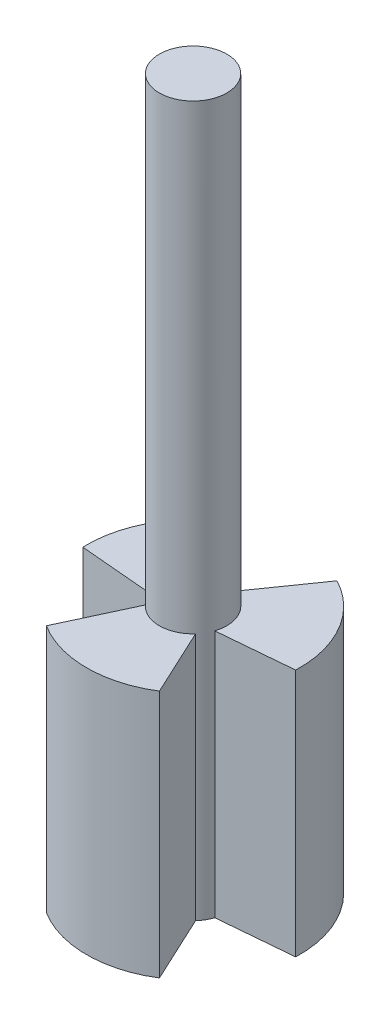
ISO-10303-21;
HEADER;
FILE_DESCRIPTION(('STEP AP214'),'2;1');
FILE_NAME('part.step','',(''),(''),'','','');
FILE_SCHEMA(('AUTOMOTIVE_DESIGN { 1 0 10303 214 1 1 1 1 }'));
ENDSEC;
DATA;
#1=APPLICATION_CONTEXT('core data for automotive mechanical design processes');
#2=APPLICATION_PROTOCOL_DEFINITION('international standard','automotive_design',2000,#1);
#3=PRODUCT_CONTEXT('',#1,'mechanical');
#4=PRODUCT('Part','Part','',(#3));
#5=PRODUCT_RELATED_PRODUCT_CATEGORY('part','',(#4));
#6=PRODUCT_DEFINITION_FORMATION('','',#4);
#7=PRODUCT_DEFINITION_CONTEXT('part definition',#1,'design');
#8=PRODUCT_DEFINITION('design','',#6,#7);
#9=PRODUCT_DEFINITION_SHAPE('','',#8);
#10=(LENGTH_UNIT() NAMED_UNIT(*) SI_UNIT(.MILLI.,.METRE.));
#11=(NAMED_UNIT(*) PLANE_ANGLE_UNIT() SI_UNIT($,.RADIAN.));
#12=(NAMED_UNIT(*) SI_UNIT($,.STERADIAN.) SOLID_ANGLE_UNIT());
#13=UNCERTAINTY_MEASURE_WITH_UNIT(LENGTH_MEASURE(1.E-05),#10,'distance_accuracy_value','');
#14=(GEOMETRIC_REPRESENTATION_CONTEXT(3) GLOBAL_UNCERTAINTY_ASSIGNED_CONTEXT((#13)) GLOBAL_UNIT_ASSIGNED_CONTEXT((#10,
#11,#12)) REPRESENTATION_CONTEXT('',''));
#15=CARTESIAN_POINT('',(0.,0.,0.));
#16=DIRECTION('',(0.,0.,1.));
#17=DIRECTION('',(1.,0.,0.));
#18=AXIS2_PLACEMENT_3D('',#15,#16,#17);
#19=CARTESIAN_POINT('',(5.59924741554355E-13,1469.49958708757,3.10503720316506E-13));
#20=DIRECTION('',(0.,-1.,0.));
#21=DIRECTION('',(0.,0.,-1.));
#22=AXIS2_PLACEMENT_3D('',#19,#20,#21);
#23=CYLINDRICAL_SURFACE('',#22,15.24);
#24=DIRECTION('',(0.,-1.,0.));
#25=VECTOR('',#24,1.);
#26=CARTESIAN_POINT('',(-8.09608369943268,1689.41142869452,12.9116625084371));
#27=LINE('',#26,#25);
#28=CARTESIAN_POINT('',(-8.09608369943268,1469.49958708757,12.9116625084371));
#29=VERTEX_POINT('',#28);
#30=CARTESIAN_POINT('',(-8.09608369943268,1433.93958708757,12.9116625084371));
#31=VERTEX_POINT('',#30);
#32=EDGE_CURVE('E134',#29,#31,#27,.T.);
#33=ORIENTED_EDGE('',*,*,#32,.T.);
#34=CARTESIAN_POINT('',(5.59924741554355E-13,1433.93958708757,3.10503720316506E-13));
#35=DIRECTION('',(0.,-1.,0.));
#36=DIRECTION('',(0.,0.,-1.));
#37=AXIS2_PLACEMENT_3D('',#34,#35,#36);
#38=CIRCLE('',#37,15.24);
#39=CARTESIAN_POINT('',(8.09608369943362,1433.93958708757,12.9116625084372));
#40=VERTEX_POINT('',#39);
#41=EDGE_CURVE('E164',#40,#31,#38,.T.);
#42=ORIENTED_EDGE('',*,*,#41,.F.);
#43=DIRECTION('',(0.,-1.,0.));
#44=VECTOR('',#43,1.);
#45=CARTESIAN_POINT('',(8.09608369943362,1689.41142869452,12.9116625084372));
#46=LINE('',#45,#44);
#47=CARTESIAN_POINT('',(8.09608369943362,1469.49958708757,12.9116625084372));
#48=VERTEX_POINT('',#47);
#49=EDGE_CURVE('E198',#48,#40,#46,.T.);
#50=ORIENTED_EDGE('',*,*,#49,.F.);
#51=CARTESIAN_POINT('',(5.59924741554355E-13,1469.49958708757,3.10503720316506E-13));
#52=DIRECTION('',(0.,-1.,0.));
#53=DIRECTION('',(0.,0.,-1.));
#54=AXIS2_PLACEMENT_3D('',#51,#52,#53);
#55=CIRCLE('',#54,15.24);
#56=EDGE_CURVE('E158',#48,#29,#55,.T.);
#57=ORIENTED_EDGE('',*,*,#56,.T.);
#58=EDGE_LOOP('',(#33,#42,#50,#57));
#59=FACE_BOUND('',#58,.T.);
#60=ADVANCED_FACE('F38',(#59),#23,.T.);
#61=CARTESIAN_POINT('',(5.59924741554355E-13,1469.49958708757,3.10503720316506E-13));
#62=DIRECTION('',(0.,-1.,0.));
#63=DIRECTION('',(0.,0.,-1.));
#64=AXIS2_PLACEMENT_3D('',#61,#62,#63);
#65=PLANE('',#64);
#66=CARTESIAN_POINT('',(5.59924741554355E-13,1469.49958708757,3.10503720316506E-13));
#67=DIRECTION('',(0.,-1.,0.));
#68=DIRECTION('',(0.,0.,-1.));
#69=AXIS2_PLACEMENT_3D('',#66,#67,#68);
#70=CIRCLE('',#69,4.826);
#71=CARTESIAN_POINT('',(3.58290527150522,1469.49958708757,3.23312013625014));
#72=VERTEX_POINT('',#71);
#73=CARTESIAN_POINT('',(-3.58290527150415,1469.49958708757,3.23312013625009));
#74=VERTEX_POINT('',#73);
#75=EDGE_CURVE('E46',#72,#74,#70,.T.);
#76=ORIENTED_EDGE('',*,*,#75,.T.);
#77=DIRECTION('',(0.422618261740707,0.,-0.906307787036647));
#78=VECTOR('',#77,1.);
#79=CARTESIAN_POINT('',(-3.58290527150415,1469.49958708757,3.23312013625009));
#80=LINE('',#79,#78);
#81=EDGE_CURVE('E137',#29,#74,#80,.T.);
#82=ORIENTED_EDGE('',*,*,#81,.F.);
#83=ORIENTED_EDGE('',*,*,#56,.F.);
#84=DIRECTION('',(0.422618261740694,0.,0.906307787036652));
#85=VECTOR('',#84,1.);
#86=CARTESIAN_POINT('',(3.58290527150522,1469.49958708757,3.23312013625014));
#87=LINE('',#86,#85);
#88=EDGE_CURVE('E147',#72,#48,#87,.T.);
#89=ORIENTED_EDGE('',*,*,#88,.F.);
#90=EDGE_LOOP('',(#76,#82,#83,#89));
#91=FACE_BOUND('',#90,.T.);
#92=ADVANCED_FACE('F146',(#91),#65,.F.);
#93=DIRECTION('',(0.,-1.,0.));
#94=VECTOR('',#93,1.);
#95=CARTESIAN_POINT('',(15.2298695871145,1689.41142869452,0.555582900656143));
#96=LINE('',#95,#94);
#97=CARTESIAN_POINT('',(15.2298695871145,1469.49958708757,0.555582900656143));
#98=VERTEX_POINT('',#97);
#99=CARTESIAN_POINT('',(15.2298695871145,1433.93958708757,0.555582900656142));
#100=VERTEX_POINT('',#99);
#101=EDGE_CURVE('E194',#98,#100,#96,.T.);
#102=ORIENTED_EDGE('',*,*,#101,.T.);
#103=CARTESIAN_POINT('',(7.13378588768141,1433.93958708757,-13.4672454090923));
#104=VERTEX_POINT('',#103);
#105=EDGE_CURVE('E162',#104,#100,#38,.T.);
#106=ORIENTED_EDGE('',*,*,#105,.F.);
#107=DIRECTION('',(0.,-1.,0.));
#108=VECTOR('',#107,1.);
#109=CARTESIAN_POINT('',(7.13378588768141,1690.00689932581,-13.4672454090923));
#110=LINE('',#109,#108);
#111=CARTESIAN_POINT('',(7.13378588768141,1469.49958708757,-13.4672454090923));
#112=VERTEX_POINT('',#111);
#113=EDGE_CURVE('E175',#112,#104,#110,.T.);
#114=ORIENTED_EDGE('',*,*,#113,.F.);
#115=EDGE_CURVE('E154',#112,#98,#55,.T.);
#116=ORIENTED_EDGE('',*,*,#115,.T.);
#117=EDGE_LOOP('',(#102,#106,#114,#116));
#118=FACE_BOUND('',#117,.T.);
#119=ADVANCED_FACE('F247',(#118),#23,.T.);
#120=CARTESIAN_POINT('',(1.00851153572756,1469.49958708757,-4.71944705260083));
#121=VERTEX_POINT('',#120);
#122=CARTESIAN_POINT('',(4.59141680723223,1469.49958708757,1.48632691635166));
#123=VERTEX_POINT('',#122);
#124=EDGE_CURVE('E11',#121,#123,#70,.T.);
#125=ORIENTED_EDGE('',*,*,#124,.T.);
#126=DIRECTION('',(-0.996194698091746,0.,0.0871557427476548));
#127=VECTOR('',#126,1.);
#128=CARTESIAN_POINT('',(4.59141680723223,1469.49958708757,1.48632691635166));
#129=LINE('',#128,#127);
#130=EDGE_CURVE('E133',#98,#123,#129,.T.);
#131=ORIENTED_EDGE('',*,*,#130,.F.);
#132=ORIENTED_EDGE('',*,*,#115,.F.);
#133=DIRECTION('',(0.573576436351047,0.,-0.819152044288991));
#134=VECTOR('',#133,1.);
#135=CARTESIAN_POINT('',(1.00851153572756,1469.49958708757,-4.71944705260083));
#136=LINE('',#135,#134);
#137=EDGE_CURVE('E178',#121,#112,#136,.T.);
#138=ORIENTED_EDGE('',*,*,#137,.F.);
#139=EDGE_LOOP('',(#125,#131,#132,#138));
#140=FACE_BOUND('',#139,.T.);
#141=ADVANCED_FACE('F240',(#140),#65,.F.);
#142=CARTESIAN_POINT('',(5.59924741554355E-13,1535.53958708757,3.10503720316506E-13));
#143=DIRECTION('',(0.,-1.,0.));
#144=DIRECTION('',(0.,0.,-1.));
#145=AXIS2_PLACEMENT_3D('',#142,#143,#144);
#146=CYLINDRICAL_SURFACE('',#145,4.826);
#147=CARTESIAN_POINT('',(5.59924741554355E-13,1535.53958708757,3.10503720316506E-13));
#148=DIRECTION('',(0.,1.,0.));
#149=DIRECTION('',(0.,0.,1.));
#150=AXIS2_PLACEMENT_3D('',#147,#148,#149);
#151=CIRCLE('',#150,4.826);
#152=CARTESIAN_POINT('',(5.59924741554355E-13,1535.53958708757,4.82600000000031));
#153=VERTEX_POINT('',#152);
#154=EDGE_CURVE('E148',#153,#153,#151,.T.);
#155=ORIENTED_EDGE('',*,*,#154,.F.);
#156=EDGE_LOOP('',(#155));
#157=FACE_BOUND('',#156,.T.);
#158=ORIENTED_EDGE('',*,*,#124,.F.);
#159=DIRECTION('',(0.,-1.,0.));
#160=VECTOR('',#159,1.);
#161=CARTESIAN_POINT('',(1.00851153572756,1690.00689932581,-4.71944705260083));
#162=LINE('',#161,#160);
#163=CARTESIAN_POINT('',(1.00851153572756,1433.93958708757,-4.71944705260083));
#164=VERTEX_POINT('',#163);
#165=EDGE_CURVE('E173',#121,#164,#162,.T.);
#166=ORIENTED_EDGE('',*,*,#165,.T.);
#167=CARTESIAN_POINT('',(5.59924741554355E-13,1433.93958708757,3.10503720316506E-13));
#168=DIRECTION('',(0.,-1.,0.));
#169=DIRECTION('',(0.,0.,-1.));
#170=AXIS2_PLACEMENT_3D('',#167,#168,#169);
#171=CIRCLE('',#170,4.826);
#172=CARTESIAN_POINT('',(-1.00851153572644,1433.93958708757,-4.71944705260083));
#173=VERTEX_POINT('',#172);
#174=EDGE_CURVE('E185',#173,#164,#171,.T.);
#175=ORIENTED_EDGE('',*,*,#174,.F.);
#176=DIRECTION('',(0.,-1.,0.));
#177=VECTOR('',#176,1.);
#178=CARTESIAN_POINT('',(-1.00851153572644,1690.00689932581,-4.71944705260083));
#179=LINE('',#178,#177);
#180=CARTESIAN_POINT('',(-1.00851153572644,1469.49958708757,-4.71944705260083));
#181=VERTEX_POINT('',#180);
#182=EDGE_CURVE('E167',#181,#173,#179,.T.);
#183=ORIENTED_EDGE('',*,*,#182,.F.);
#184=CARTESIAN_POINT('',(-4.59141680723113,1469.49958708757,1.48632691635159));
#185=VERTEX_POINT('',#184);
#186=EDGE_CURVE('E47',#185,#181,#70,.T.);
#187=ORIENTED_EDGE('',*,*,#186,.F.);
#188=DIRECTION('',(0.,-1.,0.));
#189=VECTOR('',#188,1.);
#190=CARTESIAN_POINT('',(-4.59141680723113,1689.41142869452,1.48632691635159));
#191=LINE('',#190,#189);
#192=CARTESIAN_POINT('',(-4.59141680723113,1433.93958708757,1.48632691635159));
#193=VERTEX_POINT('',#192);
#194=EDGE_CURVE('E54',#185,#193,#191,.T.);
#195=ORIENTED_EDGE('',*,*,#194,.T.);
#196=CARTESIAN_POINT('',(5.59924741554355E-13,1433.93958708757,3.10503720316506E-13));
#197=DIRECTION('',(0.,-1.,0.));
#198=DIRECTION('',(0.,0.,-1.));
#199=AXIS2_PLACEMENT_3D('',#196,#197,#198);
#200=CIRCLE('',#199,4.826);
#201=CARTESIAN_POINT('',(-3.58290527150415,1433.93958708757,3.23312013625009));
#202=VERTEX_POINT('',#201);
#203=EDGE_CURVE('E130',#202,#193,#200,.T.);
#204=ORIENTED_EDGE('',*,*,#203,.F.);
#205=DIRECTION('',(0.,-1.,0.));
#206=VECTOR('',#205,1.);
#207=CARTESIAN_POINT('',(-3.58290527150415,1689.41142869452,3.23312013625009));
#208=LINE('',#207,#206);
#209=EDGE_CURVE('E125',#74,#202,#208,.T.);
#210=ORIENTED_EDGE('',*,*,#209,.F.);
#211=ORIENTED_EDGE('',*,*,#75,.F.);
#212=DIRECTION('',(0.,-1.,0.));
#213=VECTOR('',#212,1.);
#214=CARTESIAN_POINT('',(3.58290527150522,1689.41142869452,3.23312013625014));
#215=LINE('',#214,#213);
#216=CARTESIAN_POINT('',(3.58290527150522,1433.93958708757,3.23312013625014));
#217=VERTEX_POINT('',#216);
#218=EDGE_CURVE('E61',#72,#217,#215,.T.);
#219=ORIENTED_EDGE('',*,*,#218,.T.);
#220=CARTESIAN_POINT('',(5.59924741554355E-13,1433.93958708757,3.10503720316506E-13));
#221=DIRECTION('',(0.,-1.,0.));
#222=DIRECTION('',(0.,0.,-1.));
#223=AXIS2_PLACEMENT_3D('',#220,#221,#222);
#224=CIRCLE('',#223,4.826);
#225=CARTESIAN_POINT('',(4.59141680723223,1433.93958708757,1.48632691635166));
#226=VERTEX_POINT('',#225);
#227=EDGE_CURVE('E205',#226,#217,#224,.T.);
#228=ORIENTED_EDGE('',*,*,#227,.F.);
#229=DIRECTION('',(0.,-1.,0.));
#230=VECTOR('',#229,1.);
#231=CARTESIAN_POINT('',(4.59141680723223,1689.41142869452,1.48632691635166));
#232=LINE('',#231,#230);
#233=EDGE_CURVE('E184',#123,#226,#232,.T.);
#234=ORIENTED_EDGE('',*,*,#233,.F.);
#235=EDGE_LOOP('',(#158,#166,#175,#183,#187,#195,#204,#210,#211,#219,#228,#234));
#236=FACE_BOUND('',#235,.T.);
#237=ADVANCED_FACE('F40',(#157,#236),#146,.T.);
#238=CARTESIAN_POINT('',(5.59924741554355E-13,1535.53958708757,3.10503720316506E-13));
#239=DIRECTION('',(0.,1.,0.));
#240=DIRECTION('',(0.,0.,1.));
#241=AXIS2_PLACEMENT_3D('',#238,#239,#240);
#242=PLANE('',#241);
#243=ORIENTED_EDGE('',*,*,#154,.T.);
#244=EDGE_LOOP('',(#243));
#245=FACE_BOUND('',#244,.T.);
#246=ADVANCED_FACE('F245',(#245),#242,.T.);
#247=DIRECTION('',(0.,-1.,0.));
#248=VECTOR('',#247,1.);
#249=CARTESIAN_POINT('',(-15.2298695871134,1689.41142869452,0.555582900655931));
#250=LINE('',#249,#248);
#251=CARTESIAN_POINT('',(-15.2298695871134,1469.49958708757,0.555582900655931));
#252=VERTEX_POINT('',#251);
#253=CARTESIAN_POINT('',(-15.2298695871134,1433.93958708757,0.55558290065593));
#254=VERTEX_POINT('',#253);
#255=EDGE_CURVE('E214',#252,#254,#250,.T.);
#256=ORIENTED_EDGE('',*,*,#255,.F.);
#257=CARTESIAN_POINT('',(-7.13378588768029,1469.49958708757,-13.4672454090923));
#258=VERTEX_POINT('',#257);
#259=EDGE_CURVE('E160',#252,#258,#55,.T.);
#260=ORIENTED_EDGE('',*,*,#259,.T.);
#261=DIRECTION('',(0.,-1.,0.));
#262=VECTOR('',#261,1.);
#263=CARTESIAN_POINT('',(-7.13378588768029,1690.00689932581,-13.4672454090923));
#264=LINE('',#263,#262);
#265=CARTESIAN_POINT('',(-7.13378588768029,1433.93958708757,-13.4672454090923));
#266=VERTEX_POINT('',#265);
#267=EDGE_CURVE('E170',#258,#266,#264,.T.);
#268=ORIENTED_EDGE('',*,*,#267,.T.);
#269=EDGE_CURVE('E165',#254,#266,#38,.T.);
#270=ORIENTED_EDGE('',*,*,#269,.F.);
#271=EDGE_LOOP('',(#256,#260,#268,#270));
#272=FACE_BOUND('',#271,.T.);
#273=ADVANCED_FACE('F232',(#272),#23,.T.);
#274=ORIENTED_EDGE('',*,*,#259,.F.);
#275=DIRECTION('',(-0.996194698091745,0.,-0.0871557427476687));
#276=VECTOR('',#275,1.);
#277=CARTESIAN_POINT('',(-4.59141680723113,1469.49958708757,1.48632691635159));
#278=LINE('',#277,#276);
#279=EDGE_CURVE('E143',#185,#252,#278,.T.);
#280=ORIENTED_EDGE('',*,*,#279,.F.);
#281=ORIENTED_EDGE('',*,*,#186,.T.);
#282=DIRECTION('',(0.573576436351047,0.,0.819152044288991));
#283=VECTOR('',#282,1.);
#284=CARTESIAN_POINT('',(-1.00851153572644,1469.49958708757,-4.71944705260083));
#285=LINE('',#284,#283);
#286=EDGE_CURVE('E181',#258,#181,#285,.T.);
#287=ORIENTED_EDGE('',*,*,#286,.F.);
#288=EDGE_LOOP('',(#274,#280,#281,#287));
#289=FACE_BOUND('',#288,.T.);
#290=ADVANCED_FACE('F237',(#289),#65,.F.);
#291=CARTESIAN_POINT('',(5.59924741554355E-13,1433.93958708757,3.10503720316506E-13));
#292=DIRECTION('',(0.,1.,0.));
#293=DIRECTION('',(0.,0.,1.));
#294=AXIS2_PLACEMENT_3D('',#291,#292,#293);
#295=PLANE('',#294);
#296=ORIENTED_EDGE('',*,*,#203,.T.);
#297=DIRECTION('',(-0.996194698091745,0.,-0.0871557427476687));
#298=VECTOR('',#297,1.);
#299=CARTESIAN_POINT('',(-4.59141680723113,1433.93958708757,1.48632691635159));
#300=LINE('',#299,#298);
#301=EDGE_CURVE('E217',#193,#254,#300,.T.);
#302=ORIENTED_EDGE('',*,*,#301,.T.);
#303=ORIENTED_EDGE('',*,*,#269,.T.);
#304=DIRECTION('',(0.573576436351047,0.,0.819152044288991));
#305=VECTOR('',#304,1.);
#306=CARTESIAN_POINT('',(-1.00851153572644,1433.93958708757,-4.71944705260083));
#307=LINE('',#306,#305);
#308=EDGE_CURVE('E177',#266,#173,#307,.T.);
#309=ORIENTED_EDGE('',*,*,#308,.T.);
#310=ORIENTED_EDGE('',*,*,#174,.T.);
#311=DIRECTION('',(0.573576436351047,0.,-0.819152044288991));
#312=VECTOR('',#311,1.);
#313=CARTESIAN_POINT('',(1.00851153572756,1433.93958708757,-4.71944705260083));
#314=LINE('',#313,#312);
#315=EDGE_CURVE('E180',#164,#104,#314,.T.);
#316=ORIENTED_EDGE('',*,*,#315,.T.);
#317=ORIENTED_EDGE('',*,*,#105,.T.);
#318=DIRECTION('',(-0.996194698091746,0.,0.0871557427476548));
#319=VECTOR('',#318,1.);
#320=CARTESIAN_POINT('',(4.59141680723223,1433.93958708757,1.48632691635166));
#321=LINE('',#320,#319);
#322=EDGE_CURVE('E200',#100,#226,#321,.T.);
#323=ORIENTED_EDGE('',*,*,#322,.T.);
#324=ORIENTED_EDGE('',*,*,#227,.T.);
#325=DIRECTION('',(0.422618261740694,0.,0.906307787036652));
#326=VECTOR('',#325,1.);
#327=CARTESIAN_POINT('',(3.58290527150522,1433.93958708757,3.23312013625014));
#328=LINE('',#327,#326);
#329=EDGE_CURVE('E202',#217,#40,#328,.T.);
#330=ORIENTED_EDGE('',*,*,#329,.T.);
#331=ORIENTED_EDGE('',*,*,#41,.T.);
#332=DIRECTION('',(0.422618261740707,0.,-0.906307787036647));
#333=VECTOR('',#332,1.);
#334=CARTESIAN_POINT('',(-3.58290527150415,1433.93958708757,3.23312013625009));
#335=LINE('',#334,#333);
#336=EDGE_CURVE('E216',#31,#202,#335,.T.);
#337=ORIENTED_EDGE('',*,*,#336,.T.);
#338=EDGE_LOOP('',(#296,#302,#303,#309,#310,#316,#317,#323,#324,#330,#331,#337));
#339=FACE_BOUND('',#338,.T.);
#340=ADVANCED_FACE('F224',(#339),#295,.F.);
#341=CARTESIAN_POINT('',(-1.00851153572644,1690.00689932581,-4.71944705260083));
#342=DIRECTION('',(-0.819152044288991,0.,0.573576436351047));
#343=DIRECTION('',(0.573576436351047,0.,0.819152044288991));
#344=AXIS2_PLACEMENT_3D('',#341,#342,#343);
#345=PLANE('',#344);
#346=ORIENTED_EDGE('',*,*,#286,.T.);
#347=ORIENTED_EDGE('',*,*,#182,.T.);
#348=ORIENTED_EDGE('',*,*,#308,.F.);
#349=ORIENTED_EDGE('',*,*,#267,.F.);
#350=EDGE_LOOP('',(#346,#347,#348,#349));
#351=FACE_BOUND('',#350,.T.);
#352=ADVANCED_FACE('F236',(#351),#345,.F.);
#353=CARTESIAN_POINT('',(1.00851153572756,1690.00689932581,-4.71944705260083));
#354=DIRECTION('',(0.819152044288991,0.,0.573576436351047));
#355=DIRECTION('',(0.573576436351047,0.,-0.819152044288991));
#356=AXIS2_PLACEMENT_3D('',#353,#354,#355);
#357=PLANE('',#356);
#358=ORIENTED_EDGE('',*,*,#137,.T.);
#359=ORIENTED_EDGE('',*,*,#113,.T.);
#360=ORIENTED_EDGE('',*,*,#315,.F.);
#361=ORIENTED_EDGE('',*,*,#165,.F.);
#362=EDGE_LOOP('',(#358,#359,#360,#361));
#363=FACE_BOUND('',#362,.T.);
#364=ADVANCED_FACE('F267',(#363),#357,.F.);
#365=CARTESIAN_POINT('',(4.59141680723223,1689.41142869452,1.48632691635166));
#366=DIRECTION('',(-0.0871557427476548,0.,-0.996194698091746));
#367=DIRECTION('',(-0.996194698091746,0.,0.0871557427476548));
#368=AXIS2_PLACEMENT_3D('',#365,#366,#367);
#369=PLANE('',#368);
#370=ORIENTED_EDGE('',*,*,#130,.T.);
#371=ORIENTED_EDGE('',*,*,#233,.T.);
#372=ORIENTED_EDGE('',*,*,#322,.F.);
#373=ORIENTED_EDGE('',*,*,#101,.F.);
#374=EDGE_LOOP('',(#370,#371,#372,#373));
#375=FACE_BOUND('',#374,.T.);
#376=ADVANCED_FACE('F269',(#375),#369,.F.);
#377=CARTESIAN_POINT('',(3.58290527150522,1689.41142869452,3.23312013625014));
#378=DIRECTION('',(-0.906307787036652,0.,0.422618261740694));
#379=DIRECTION('',(0.422618261740694,0.,0.906307787036652));
#380=AXIS2_PLACEMENT_3D('',#377,#378,#379);
#381=PLANE('',#380);
#382=ORIENTED_EDGE('',*,*,#88,.T.);
#383=ORIENTED_EDGE('',*,*,#49,.T.);
#384=ORIENTED_EDGE('',*,*,#329,.F.);
#385=ORIENTED_EDGE('',*,*,#218,.F.);
#386=EDGE_LOOP('',(#382,#383,#384,#385));
#387=FACE_BOUND('',#386,.T.);
#388=ADVANCED_FACE('F271',(#387),#381,.F.);
#389=CARTESIAN_POINT('',(-3.58290527150415,1689.41142869452,3.23312013625009));
#390=DIRECTION('',(0.906307787036647,0.,0.422618261740707));
#391=DIRECTION('',(0.422618261740707,0.,-0.906307787036647));
#392=AXIS2_PLACEMENT_3D('',#389,#390,#391);
#393=PLANE('',#392);
#394=ORIENTED_EDGE('',*,*,#81,.T.);
#395=ORIENTED_EDGE('',*,*,#209,.T.);
#396=ORIENTED_EDGE('',*,*,#336,.F.);
#397=ORIENTED_EDGE('',*,*,#32,.F.);
#398=EDGE_LOOP('',(#394,#395,#396,#397));
#399=FACE_BOUND('',#398,.T.);
#400=ADVANCED_FACE('F138',(#399),#393,.F.);
#401=CARTESIAN_POINT('',(-4.59141680723113,1689.41142869452,1.48632691635159));
#402=DIRECTION('',(0.0871557427476687,0.,-0.996194698091745));
#403=DIRECTION('',(-0.996194698091745,0.,-0.0871557427476687));
#404=AXIS2_PLACEMENT_3D('',#401,#402,#403);
#405=PLANE('',#404);
#406=ORIENTED_EDGE('',*,*,#279,.T.);
#407=ORIENTED_EDGE('',*,*,#255,.T.);
#408=ORIENTED_EDGE('',*,*,#301,.F.);
#409=ORIENTED_EDGE('',*,*,#194,.F.);
#410=EDGE_LOOP('',(#406,#407,#408,#409));
#411=FACE_BOUND('',#410,.T.);
#412=ADVANCED_FACE('F278',(#411),#405,.F.);
#413=CLOSED_SHELL('',(#60,#92,#119,#141,#237,#246,#273,#290,#340,#352,#364,#376,#388,#400,#412));
#414=MANIFOLD_SOLID_BREP('B2',#413);
#415=ADVANCED_BREP_SHAPE_REPRESENTATION('',(#18,#414),#14);
#416=SHAPE_DEFINITION_REPRESENTATION(#9,#415);
ENDSEC;
END-ISO-10303-21;
